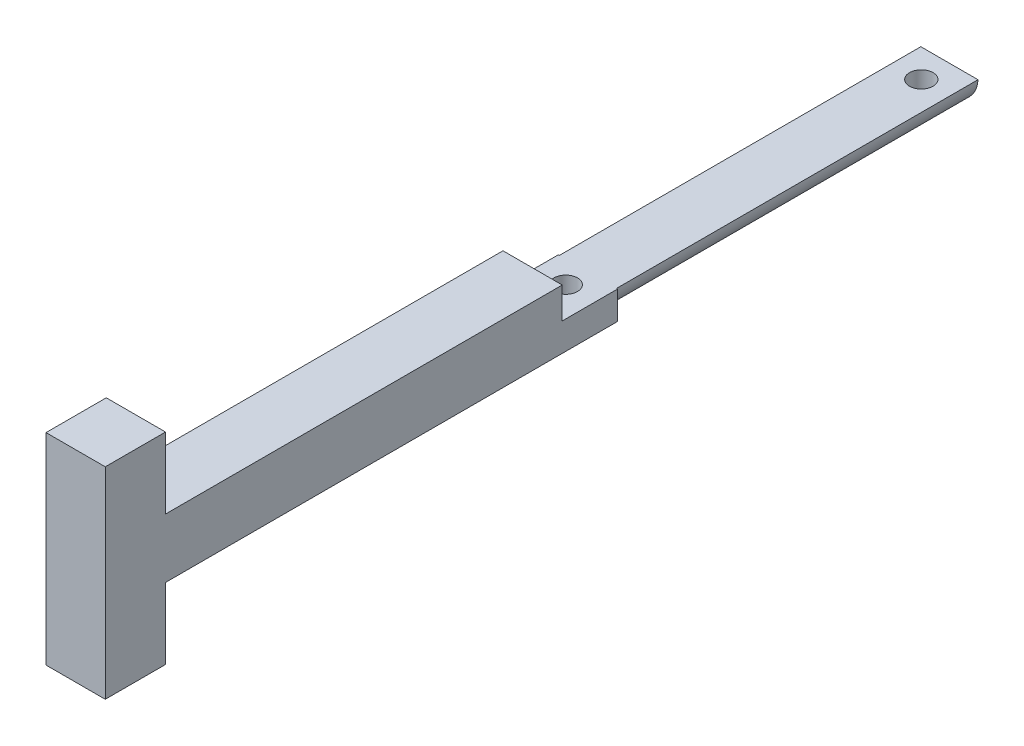
ISO-10303-21;
HEADER;
FILE_DESCRIPTION(('STEP AP214'),'2;1');
FILE_NAME('part.step','',(''),(''),'','','');
FILE_SCHEMA(('AUTOMOTIVE_DESIGN { 1 0 10303 214 1 1 1 1 }'));
ENDSEC;
DATA;
#1=APPLICATION_CONTEXT('core data for automotive mechanical design processes');
#2=APPLICATION_PROTOCOL_DEFINITION('international standard','automotive_design',2000,#1);
#3=PRODUCT_CONTEXT('',#1,'mechanical');
#4=PRODUCT('Part','Part','',(#3));
#5=PRODUCT_RELATED_PRODUCT_CATEGORY('part','',(#4));
#6=PRODUCT_DEFINITION_FORMATION('','',#4);
#7=PRODUCT_DEFINITION_CONTEXT('part definition',#1,'design');
#8=PRODUCT_DEFINITION('design','',#6,#7);
#9=PRODUCT_DEFINITION_SHAPE('','',#8);
#10=(LENGTH_UNIT() NAMED_UNIT(*) SI_UNIT(.MILLI.,.METRE.));
#11=(NAMED_UNIT(*) PLANE_ANGLE_UNIT() SI_UNIT($,.RADIAN.));
#12=(NAMED_UNIT(*) SI_UNIT($,.STERADIAN.) SOLID_ANGLE_UNIT());
#13=UNCERTAINTY_MEASURE_WITH_UNIT(LENGTH_MEASURE(1.E-05),#10,'distance_accuracy_value','');
#14=(GEOMETRIC_REPRESENTATION_CONTEXT(3) GLOBAL_UNCERTAINTY_ASSIGNED_CONTEXT((#13)) GLOBAL_UNIT_ASSIGNED_CONTEXT((#10,
#11,#12)) REPRESENTATION_CONTEXT('',''));
#15=CARTESIAN_POINT('',(0.,0.,0.));
#16=DIRECTION('',(0.,0.,1.));
#17=DIRECTION('',(1.,0.,0.));
#18=AXIS2_PLACEMENT_3D('',#15,#16,#17);
#19=CARTESIAN_POINT('',(0.,-7.05,-2.2));
#20=DIRECTION('',(0.,1.,0.));
#21=DIRECTION('',(-1.,0.,0.));
#22=AXIS2_PLACEMENT_3D('',#19,#20,#21);
#23=CYLINDRICAL_SURFACE('',#22,1.175);
#24=CARTESIAN_POINT('',(0.,-0.149999999999999,-2.2));
#25=DIRECTION('',(0.,-1.,0.));
#26=DIRECTION('',(0.,0.,-1.));
#27=AXIS2_PLACEMENT_3D('',#24,#25,#26);
#28=CIRCLE('',#27,1.175);
#29=CARTESIAN_POINT('',(0.,-0.149999999999999,-3.375));
#30=VERTEX_POINT('',#29);
#31=EDGE_CURVE('E169',#30,#30,#28,.F.);
#32=ORIENTED_EDGE('',*,*,#31,.T.);
#33=EDGE_LOOP('',(#32));
#34=FACE_BOUND('',#33,.T.);
#35=CARTESIAN_POINT('',(-1.175,-2.59651208354592,-2.2));
#36=CARTESIAN_POINT('',(-1.17499329710583,-2.59651851272934,-2.13726128833087));
#37=CARTESIAN_POINT('',(-1.16994332561099,-2.59881906653009,-2.07441742069479));
#38=CARTESIAN_POINT('',(-1.14993654664118,-2.60773039865933,-1.95053928076174));
#39=CARTESIAN_POINT('',(-1.1349525796863,-2.61435299264052,-1.88951045004657));
#40=CARTESIAN_POINT('',(-1.09575667793182,-2.63101984862373,-1.77127626311953));
#41=CARTESIAN_POINT('',(-1.07158182466941,-2.64105034404038,-1.71405661447788));
#42=CARTESIAN_POINT('',(-1.01479902027141,-2.66338317673593,-1.60450223218359));
#43=CARTESIAN_POINT('',(-0.982193187209018,-2.67568494319303,-1.55216627611269));
#44=CARTESIAN_POINT('',(-0.907350757531601,-2.70201232191426,-1.45064545106289));
#45=CARTESIAN_POINT('',(-0.864681812568224,-2.71609561143148,-1.40179411248883));
#46=CARTESIAN_POINT('',(-0.771832663840417,-2.74392456868612,-1.31169458610813));
#47=CARTESIAN_POINT('',(-0.721649612293354,-2.7576701061092,-1.27044929421138));
#48=CARTESIAN_POINT('',(-0.612589122427016,-2.78397332974996,-1.19504448954162));
#49=CARTESIAN_POINT('',(-0.553433661608107,-2.79645615292838,-1.16125860479524));
#50=CARTESIAN_POINT('',(-0.429671477718866,-2.81812346563897,-1.10426153124341));
#51=CARTESIAN_POINT('',(-0.365067141072957,-2.82730938993306,-1.0810457413039));
#52=CARTESIAN_POINT('',(-0.235741207776902,-2.84093910139708,-1.04705161624532));
#53=CARTESIAN_POINT('',(-0.171194144990525,-2.84560113843011,-1.03569857862762));
#54=CARTESIAN_POINT('',(-0.0409540525128829,-2.85044952385287,-1.02389693806895));
#55=CARTESIAN_POINT('',(0.0247385122554054,-2.85063764761258,-1.02344400966854));
#56=CARTESIAN_POINT('',(0.151232626674928,-2.84664665650361,-1.03315058406118));
#57=CARTESIAN_POINT('',(0.21209230755517,-2.8427271944627,-1.04267911305258));
#58=CARTESIAN_POINT('',(0.331259334937749,-2.83131624854964,-1.07099873274938));
#59=CARTESIAN_POINT('',(0.389566493156407,-2.82382450165542,-1.08979050549724));
#60=CARTESIAN_POINT('',(0.503038768563509,-2.8058519275574,-1.13632891912547));
#61=CARTESIAN_POINT('',(0.558142550326341,-2.79532733818341,-1.16420751160991));
#62=CARTESIAN_POINT('',(0.66303362578684,-2.77232286186529,-1.22800047996629));
#63=CARTESIAN_POINT('',(0.712819044994588,-2.75984228932136,-1.26391767537918));
#64=CARTESIAN_POINT('',(0.809320734037079,-2.73316251849976,-1.34566105589417));
#65=CARTESIAN_POINT('',(0.85558608732322,-2.71890415640297,-1.39200101150407));
#66=CARTESIAN_POINT('',(0.939881079327661,-2.6909292659936,-1.49182035298154));
#67=CARTESIAN_POINT('',(0.977907672082037,-2.67721293960492,-1.54530236757832));
#68=CARTESIAN_POINT('',(1.04576901012178,-2.65145802120997,-1.6600274644406));
#69=CARTESIAN_POINT('',(1.07530688457442,-2.63948615097963,-1.72146240658446));
#70=CARTESIAN_POINT('',(1.12343498471141,-2.61936678436805,-1.84905932213926));
#71=CARTESIAN_POINT('',(1.1420328469957,-2.61121662107875,-1.91521796194464));
#72=CARTESIAN_POINT('',(1.16661959391837,-2.60032101010456,-2.04587074915053));
#73=CARTESIAN_POINT('',(1.17333825868394,-2.59726347760415,-2.11020111439051));
#74=CARTESIAN_POINT('',(1.17611541110972,-2.59600788562174,-2.23912881853631));
#75=CARTESIAN_POINT('',(1.17217746019271,-2.59780820265414,-2.30372606104781));
#76=CARTESIAN_POINT('',(1.15441877379919,-2.60574358301127,-2.42712937419615));
#77=CARTESIAN_POINT('',(1.14122697599662,-2.61160250247034,-2.48604595661254));
#78=CARTESIAN_POINT('',(1.10616378705067,-2.6266447961046,-2.60078354119904));
#79=CARTESIAN_POINT('',(1.08429039520324,-2.63582893654588,-2.6566038264345));
#80=CARTESIAN_POINT('',(1.03146633511012,-2.65695620225538,-2.76617659319805));
#81=CARTESIAN_POINT('',(1.00017373172697,-2.6689988047802,-2.81974443658798));
#82=CARTESIAN_POINT('',(0.929742181906772,-2.69434199782386,-2.92112265933136));
#83=CARTESIAN_POINT('',(0.890599891127926,-2.70764312325344,-2.96893057073386));
#84=CARTESIAN_POINT('',(0.801916163022788,-2.73527901171184,-3.0613801506117));
#85=CARTESIAN_POINT('',(0.751795887637102,-2.74961201292547,-3.10546924500052));
#86=CARTESIAN_POINT('',(0.644533164561743,-2.77671273120582,-3.18470671980217));
#87=CARTESIAN_POINT('',(0.587390266287499,-2.78948034772944,-3.21985452608064));
#88=CARTESIAN_POINT('',(0.467357452781206,-2.81208258092243,-3.28014720091478));
#89=CARTESIAN_POINT('',(0.404457550289555,-2.82191196937146,-3.30527426500057));
#90=CARTESIAN_POINT('',(0.274815297935318,-2.83746859839297,-3.34441202534989));
#91=CARTESIAN_POINT('',(0.208075205910761,-2.84319822332421,-3.3584291834738));
#92=CARTESIAN_POINT('',(0.0775921257149425,-2.84964071454381,-3.37414786704286));
#93=CARTESIAN_POINT('',(0.0139580754073257,-2.85067108479243,-3.37662906113305));
#94=CARTESIAN_POINT('',(-0.112794467566046,-2.8484719532813,-3.37129158662869));
#95=CARTESIAN_POINT('',(-0.175913045492914,-2.84524317097358,-3.36347465758365));
#96=CARTESIAN_POINT('',(-0.297622259403981,-2.83505333694944,-3.33832219810234));
#97=CARTESIAN_POINT('',(-0.356293921001832,-2.82822363094716,-3.32132115758578));
#98=CARTESIAN_POINT('',(-0.46993337808027,-2.81157676017639,-3.27864439920616));
#99=CARTESIAN_POINT('',(-0.524900460063007,-2.80175902191327,-3.25296701598356));
#100=CARTESIAN_POINT('',(-0.632292036683678,-2.77954114016312,-3.1923723079047));
#101=CARTESIAN_POINT('',(-0.684490966558574,-2.76704470566457,-3.15709133044169));
#102=CARTESIAN_POINT('',(-0.782448421552795,-2.74095754879123,-3.07882501670758));
#103=CARTESIAN_POINT('',(-0.828204607595317,-2.72736643178614,-3.03583689512192));
#104=CARTESIAN_POINT('',(-0.915133244033183,-2.69949102821242,-2.940009003795));
#105=CARTESIAN_POINT('',(-0.955799920384749,-2.68522060417839,-2.88670474318381));
#106=CARTESIAN_POINT('',(-1.02767966458612,-2.65854293428749,-2.77357646909639));
#107=CARTESIAN_POINT('',(-1.05888751033524,-2.64613671953572,-2.71374887886453));
#108=CARTESIAN_POINT('',(-1.11059027104971,-2.6248561786182,-2.58950431401495));
#109=CARTESIAN_POINT('',(-1.131154467251,-2.6159591035555,-2.5251202016445));
#110=CARTESIAN_POINT('',(-1.16091669730976,-2.60289227340324,-2.39344507318811));
#111=CARTESIAN_POINT('',(-1.17015285752539,-2.59870666503546,-2.32616460121775));
#112=CARTESIAN_POINT('',(-1.17451365135615,-2.59673120959809,-2.23912268021968));
#113=CARTESIAN_POINT('',(-1.17500209044571,-2.59651007846296,-2.21956645406586));
#114=CARTESIAN_POINT('',(-1.175,-2.59651208354592,-2.2));
#115=B_SPLINE_CURVE_WITH_KNOTS('',3,(#35,#36,#37,#38,#39,#40,#41,#42,#43,#44,#45,#46,#47,#48,
#49,#50,#51,#52,#53,#54,#55,#56,#57,#58,#59,#60,#61,#62,#63,#64,#65,#66,#67,#68,#69,#70,#71,#72,
#73,#74,#75,#76,#77,#78,#79,#80,#81,#82,#83,#84,#85,#86,#87,#88,#89,#90,#91,#92,#93,#94,#95,#96,
#97,#98,#99,#100,#101,#102,#103,#104,#105,#106,#107,#108,#109,#110,#111,#112,#113,#114),
.UNSPECIFIED.,.T.,.F.,(4,2,2,2,2,2,2,2,2,2,2,2,2,2,2,2,2,2,2,2,2,2,2,2,2,2,2,2,2,2,2,2,2,2,2,2,
2,2,2,4),(0.,0.188161039054424,0.376838642381761,0.564762949766108,0.752640091651659,
0.950890590110442,1.14921641489652,1.35593329330019,1.5625601021654,1.7586330055383,
1.95462810057343,2.1389403699335,2.32326621203063,2.51039774840544,2.69759502434094,
2.8977487379925,3.09797632496058,3.30453179568287,3.51094291015932,3.70416424482463,
3.89732101322513,4.07848218017497,4.25968512061967,4.44848042429363,4.63735633532579,
4.84122506265824,5.04510687742401,5.24934934468285,5.45347293093555,5.64357830884874,
5.83365157845292,6.01722792018703,6.200839518071,6.39270971456264,6.58464939205362,
6.78932804409925,6.99411949166524,7.19756060180845,7.40031510184158,7.45899728114833),.UNSPECIFIED.);
#116=CARTESIAN_POINT('',(-1.175,-2.59651208354592,-2.2));
#117=VERTEX_POINT('',#116);
#118=EDGE_CURVE('E142',#117,#117,#115,.T.);
#119=ORIENTED_EDGE('',*,*,#118,.F.);
#120=EDGE_LOOP('',(#119));
#121=FACE_BOUND('',#120,.T.);
#122=ADVANCED_FACE('F34',(#34,#121),#23,.F.);
#123=CARTESIAN_POINT('',(-7.05,-0.149999999999999,-5.));
#124=DIRECTION('',(0.,-1.,0.));
#125=DIRECTION('',(0.,0.,-1.));
#126=AXIS2_PLACEMENT_3D('',#123,#124,#125);
#127=PLANE('',#126);
#128=CARTESIAN_POINT('',(0.,-0.150000000000003,33.2));
#129=DIRECTION('',(0.,-1.,0.));
#130=DIRECTION('',(0.,0.,-1.));
#131=AXIS2_PLACEMENT_3D('',#128,#129,#130);
#132=CIRCLE('',#131,1.175);
#133=CARTESIAN_POINT('',(0.,-0.150000000000003,32.025));
#134=VERTEX_POINT('',#133);
#135=EDGE_CURVE('E38',#134,#134,#132,.F.);
#136=ORIENTED_EDGE('',*,*,#135,.F.);
#137=EDGE_LOOP('',(#136));
#138=FACE_BOUND('',#137,.T.);
#139=ORIENTED_EDGE('',*,*,#31,.F.);
#140=EDGE_LOOP('',(#139));
#141=FACE_BOUND('',#140,.T.);
#142=DIRECTION('',(0.,0.,-1.));
#143=VECTOR('',#142,1.);
#144=CARTESIAN_POINT('',(2.84604989415154,-0.150000000000004,31.));
#145=LINE('',#144,#143);
#146=CARTESIAN_POINT('',(2.84604989415154,-0.149999999999999,-5.));
#147=VERTEX_POINT('',#146);
#148=CARTESIAN_POINT('',(2.84604989415154,-0.150000000000004,31.));
#149=VERTEX_POINT('',#148);
#150=EDGE_CURVE('E153',#147,#149,#145,.F.);
#151=ORIENTED_EDGE('',*,*,#150,.F.);
#152=DIRECTION('',(1.,0.,0.));
#153=VECTOR('',#152,1.);
#154=CARTESIAN_POINT('',(-7.05,-0.149999999999999,-5.));
#155=LINE('',#154,#153);
#156=CARTESIAN_POINT('',(-2.84604989415154,-0.150000000000001,-5.));
#157=VERTEX_POINT('',#156);
#158=EDGE_CURVE('E138',#157,#147,#155,.T.);
#159=ORIENTED_EDGE('',*,*,#158,.F.);
#160=DIRECTION('',(0.,0.,-1.));
#161=VECTOR('',#160,1.);
#162=CARTESIAN_POINT('',(-2.84604989415154,-0.150000000000003,31.));
#163=LINE('',#162,#161);
#164=CARTESIAN_POINT('',(-2.84604989415154,-0.150000000000003,31.));
#165=VERTEX_POINT('',#164);
#166=EDGE_CURVE('E145',#165,#157,#163,.T.);
#167=ORIENTED_EDGE('',*,*,#166,.F.);
#168=DIRECTION('',(1.,0.,0.));
#169=VECTOR('',#168,1.);
#170=CARTESIAN_POINT('',(0.,-0.150000000000004,31.));
#171=LINE('',#170,#169);
#172=CARTESIAN_POINT('',(-2.95,-0.150000000000004,31.));
#173=VERTEX_POINT('',#172);
#174=EDGE_CURVE('E150',#173,#165,#171,.T.);
#175=ORIENTED_EDGE('',*,*,#174,.F.);
#176=DIRECTION('',(0.,0.,-1.));
#177=VECTOR('',#176,1.);
#178=CARTESIAN_POINT('',(-2.95,-0.150000000000009,76.));
#179=LINE('',#178,#177);
#180=CARTESIAN_POINT('',(-2.95,-0.150000000000004,36.5));
#181=VERTEX_POINT('',#180);
#182=EDGE_CURVE('E157',#181,#173,#179,.T.);
#183=ORIENTED_EDGE('',*,*,#182,.F.);
#184=DIRECTION('',(1.,0.,0.));
#185=VECTOR('',#184,1.);
#186=CARTESIAN_POINT('',(-7.05,-0.150000000000004,36.5));
#187=LINE('',#186,#185);
#188=CARTESIAN_POINT('',(2.95,-0.150000000000004,36.5));
#189=VERTEX_POINT('',#188);
#190=EDGE_CURVE('E154',#181,#189,#187,.T.);
#191=ORIENTED_EDGE('',*,*,#190,.T.);
#192=DIRECTION('',(0.,0.,-1.));
#193=VECTOR('',#192,1.);
#194=CARTESIAN_POINT('',(2.95,-0.149999999999999,-5.));
#195=LINE('',#194,#193);
#196=CARTESIAN_POINT('',(2.95,-0.150000000000004,31.));
#197=VERTEX_POINT('',#196);
#198=EDGE_CURVE('E161',#189,#197,#195,.T.);
#199=ORIENTED_EDGE('',*,*,#198,.T.);
#200=EDGE_CURVE('E149',#149,#197,#171,.T.);
#201=ORIENTED_EDGE('',*,*,#200,.F.);
#202=EDGE_LOOP('',(#151,#159,#167,#175,#183,#191,#199,#201));
#203=FACE_BOUND('',#202,.T.);
#204=ADVANCED_FACE('F152',(#138,#141,#203),#127,.F.);
#205=CARTESIAN_POINT('',(0.,0.,31.));
#206=DIRECTION('',(0.,0.,-1.));
#207=DIRECTION('',(-1.,0.,0.));
#208=AXIS2_PLACEMENT_3D('',#205,#206,#207);
#209=CYLINDRICAL_SURFACE('',#208,2.85);
#210=CARTESIAN_POINT('',(0.,0.,31.));
#211=DIRECTION('',(0.,0.,1.));
#212=DIRECTION('',(1.,0.,0.));
#213=AXIS2_PLACEMENT_3D('',#210,#211,#212);
#214=CIRCLE('',#213,2.85);
#215=EDGE_CURVE('E12',#165,#149,#214,.T.);
#216=ORIENTED_EDGE('',*,*,#215,.F.);
#217=ORIENTED_EDGE('',*,*,#166,.T.);
#218=CARTESIAN_POINT('',(0.,0.,-5.));
#219=DIRECTION('',(0.,0.,1.));
#220=DIRECTION('',(1.,0.,0.));
#221=AXIS2_PLACEMENT_3D('',#218,#219,#220);
#222=CIRCLE('',#221,2.85);
#223=EDGE_CURVE('E134',#157,#147,#222,.T.);
#224=ORIENTED_EDGE('',*,*,#223,.T.);
#225=ORIENTED_EDGE('',*,*,#150,.T.);
#226=EDGE_LOOP('',(#216,#217,#224,#225));
#227=FACE_BOUND('',#226,.T.);
#228=ORIENTED_EDGE('',*,*,#118,.T.);
#229=EDGE_LOOP('',(#228));
#230=FACE_BOUND('',#229,.T.);
#231=ADVANCED_FACE('F36',(#227,#230),#209,.T.);
#232=CARTESIAN_POINT('',(0.,0.,31.));
#233=DIRECTION('',(0.,0.,1.));
#234=DIRECTION('',(1.,0.,0.));
#235=AXIS2_PLACEMENT_3D('',#232,#233,#234);
#236=PLANE('',#235);
#237=DIRECTION('',(0.,-1.,0.));
#238=VECTOR('',#237,1.);
#239=CARTESIAN_POINT('',(-2.95,-2.95,31.));
#240=LINE('',#239,#238);
#241=CARTESIAN_POINT('',(-2.95,-2.95,31.));
#242=VERTEX_POINT('',#241);
#243=EDGE_CURVE('E202',#173,#242,#240,.T.);
#244=ORIENTED_EDGE('',*,*,#243,.F.);
#245=ORIENTED_EDGE('',*,*,#174,.T.);
#246=ORIENTED_EDGE('',*,*,#215,.T.);
#247=ORIENTED_EDGE('',*,*,#200,.T.);
#248=DIRECTION('',(0.,1.,0.));
#249=VECTOR('',#248,1.);
#250=CARTESIAN_POINT('',(2.95,-2.95,31.));
#251=LINE('',#250,#249);
#252=CARTESIAN_POINT('',(2.95,-2.95,31.));
#253=VERTEX_POINT('',#252);
#254=EDGE_CURVE('E233',#253,#197,#251,.T.);
#255=ORIENTED_EDGE('',*,*,#254,.F.);
#256=DIRECTION('',(1.,0.,0.));
#257=VECTOR('',#256,1.);
#258=CARTESIAN_POINT('',(2.95,-2.95,31.));
#259=LINE('',#258,#257);
#260=EDGE_CURVE('E75',#242,#253,#259,.T.);
#261=ORIENTED_EDGE('',*,*,#260,.F.);
#262=EDGE_LOOP('',(#244,#245,#246,#247,#255,#261));
#263=FACE_BOUND('',#262,.T.);
#264=ADVANCED_FACE('F260',(#263),#236,.F.);
#265=CARTESIAN_POINT('',(-2.95,-2.95,76.));
#266=DIRECTION('',(1.,0.,0.));
#267=DIRECTION('',(0.,0.,-1.));
#268=AXIS2_PLACEMENT_3D('',#265,#266,#267);
#269=PLANE('',#268);
#270=DIRECTION('',(0.,-1.,0.));
#271=VECTOR('',#270,1.);
#272=CARTESIAN_POINT('',(-2.95,-2.95,36.5));
#273=LINE('',#272,#271);
#274=CARTESIAN_POINT('',(-2.95,2.95,36.5));
#275=VERTEX_POINT('',#274);
#276=EDGE_CURVE('E51',#275,#181,#273,.T.);
#277=ORIENTED_EDGE('',*,*,#276,.T.);
#278=ORIENTED_EDGE('',*,*,#182,.T.);
#279=ORIENTED_EDGE('',*,*,#243,.T.);
#280=DIRECTION('',(0.,0.,-1.));
#281=VECTOR('',#280,1.);
#282=CARTESIAN_POINT('',(-2.95,-2.95,76.));
#283=LINE('',#282,#281);
#284=CARTESIAN_POINT('',(-2.95,-2.95,76.));
#285=VERTEX_POINT('',#284);
#286=EDGE_CURVE('E43',#285,#242,#283,.T.);
#287=ORIENTED_EDGE('',*,*,#286,.F.);
#288=DIRECTION('',(0.,-1.,0.));
#289=VECTOR('',#288,1.);
#290=CARTESIAN_POINT('',(-2.95,-10.0245516400868,76.));
#291=LINE('',#290,#289);
#292=CARTESIAN_POINT('',(-2.95,-10.0245516400868,76.));
#293=VERTEX_POINT('',#292);
#294=EDGE_CURVE('E176',#285,#293,#291,.T.);
#295=ORIENTED_EDGE('',*,*,#294,.T.);
#296=DIRECTION('',(0.,0.,-1.));
#297=VECTOR('',#296,1.);
#298=CARTESIAN_POINT('',(-2.95,-10.0245516400868,82.));
#299=LINE('',#298,#297);
#300=CARTESIAN_POINT('',(-2.95,-10.0245516400868,82.));
#301=VERTEX_POINT('',#300);
#302=EDGE_CURVE('E199',#301,#293,#299,.T.);
#303=ORIENTED_EDGE('',*,*,#302,.F.);
#304=DIRECTION('',(0.,-1.,0.));
#305=VECTOR('',#304,1.);
#306=CARTESIAN_POINT('',(-2.95,-10.0245516400868,82.));
#307=LINE('',#306,#305);
#308=CARTESIAN_POINT('',(-2.95,10.0245516400868,82.));
#309=VERTEX_POINT('',#308);
#310=EDGE_CURVE('E177',#309,#301,#307,.T.);
#311=ORIENTED_EDGE('',*,*,#310,.F.);
#312=DIRECTION('',(0.,0.,-1.));
#313=VECTOR('',#312,1.);
#314=CARTESIAN_POINT('',(-2.95,10.0245516400868,82.));
#315=LINE('',#314,#313);
#316=CARTESIAN_POINT('',(-2.95,10.0245516400868,76.));
#317=VERTEX_POINT('',#316);
#318=EDGE_CURVE('E187',#309,#317,#315,.T.);
#319=ORIENTED_EDGE('',*,*,#318,.T.);
#320=CARTESIAN_POINT('',(-2.95,2.95,76.));
#321=VERTEX_POINT('',#320);
#322=EDGE_CURVE('E196',#317,#321,#291,.T.);
#323=ORIENTED_EDGE('',*,*,#322,.T.);
#324=DIRECTION('',(0.,0.,-1.));
#325=VECTOR('',#324,1.);
#326=CARTESIAN_POINT('',(-2.95,2.95,76.));
#327=LINE('',#326,#325);
#328=EDGE_CURVE('E236',#321,#275,#327,.T.);
#329=ORIENTED_EDGE('',*,*,#328,.T.);
#330=EDGE_LOOP('',(#277,#278,#279,#287,#295,#303,#311,#319,#323,#329));
#331=FACE_BOUND('',#330,.T.);
#332=ADVANCED_FACE('F257',(#331),#269,.F.);
#333=CARTESIAN_POINT('',(2.95,-2.95,76.));
#334=DIRECTION('',(0.,1.,0.));
#335=DIRECTION('',(0.,0.,1.));
#336=AXIS2_PLACEMENT_3D('',#333,#334,#335);
#337=PLANE('',#336);
#338=CARTESIAN_POINT('',(0.,-2.95,33.2));
#339=DIRECTION('',(0.,1.,0.));
#340=DIRECTION('',(0.,0.,1.));
#341=AXIS2_PLACEMENT_3D('',#338,#339,#340);
#342=CIRCLE('',#341,1.175);
#343=CARTESIAN_POINT('',(0.,-2.95,34.375));
#344=VERTEX_POINT('',#343);
#345=EDGE_CURVE('E173',#344,#344,#342,.T.);
#346=ORIENTED_EDGE('',*,*,#345,.T.);
#347=EDGE_LOOP('',(#346));
#348=FACE_BOUND('',#347,.T.);
#349=ORIENTED_EDGE('',*,*,#260,.T.);
#350=DIRECTION('',(0.,0.,-1.));
#351=VECTOR('',#350,1.);
#352=CARTESIAN_POINT('',(2.95,-2.95,76.));
#353=LINE('',#352,#351);
#354=CARTESIAN_POINT('',(2.95,-2.95,76.));
#355=VERTEX_POINT('',#354);
#356=EDGE_CURVE('E243',#355,#253,#353,.T.);
#357=ORIENTED_EDGE('',*,*,#356,.F.);
#358=DIRECTION('',(1.,0.,0.));
#359=VECTOR('',#358,1.);
#360=CARTESIAN_POINT('',(2.95,-2.95,76.));
#361=LINE('',#360,#359);
#362=EDGE_CURVE('E79',#285,#355,#361,.T.);
#363=ORIENTED_EDGE('',*,*,#362,.F.);
#364=ORIENTED_EDGE('',*,*,#286,.T.);
#365=EDGE_LOOP('',(#349,#357,#363,#364));
#366=FACE_BOUND('',#365,.T.);
#367=ADVANCED_FACE('F262',(#348,#366),#337,.F.);
#368=CARTESIAN_POINT('',(2.95,-2.95,76.));
#369=DIRECTION('',(-1.,0.,0.));
#370=DIRECTION('',(0.,0.,1.));
#371=AXIS2_PLACEMENT_3D('',#368,#369,#370);
#372=PLANE('',#371);
#373=ORIENTED_EDGE('',*,*,#254,.T.);
#374=ORIENTED_EDGE('',*,*,#198,.F.);
#375=DIRECTION('',(0.,-1.,0.));
#376=VECTOR('',#375,1.);
#377=CARTESIAN_POINT('',(2.95,2.95,36.5));
#378=LINE('',#377,#376);
#379=CARTESIAN_POINT('',(2.95,2.95,36.5));
#380=VERTEX_POINT('',#379);
#381=EDGE_CURVE('E290',#380,#189,#378,.T.);
#382=ORIENTED_EDGE('',*,*,#381,.F.);
#383=DIRECTION('',(0.,0.,-1.));
#384=VECTOR('',#383,1.);
#385=CARTESIAN_POINT('',(2.95,2.95,76.));
#386=LINE('',#385,#384);
#387=CARTESIAN_POINT('',(2.95,2.95,76.));
#388=VERTEX_POINT('',#387);
#389=EDGE_CURVE('E60',#388,#380,#386,.T.);
#390=ORIENTED_EDGE('',*,*,#389,.F.);
#391=DIRECTION('',(0.,1.,0.));
#392=VECTOR('',#391,1.);
#393=CARTESIAN_POINT('',(2.95,-10.0245516400868,76.));
#394=LINE('',#393,#392);
#395=CARTESIAN_POINT('',(2.95,10.0245516400868,76.));
#396=VERTEX_POINT('',#395);
#397=EDGE_CURVE('E215',#388,#396,#394,.T.);
#398=ORIENTED_EDGE('',*,*,#397,.T.);
#399=DIRECTION('',(0.,0.,-1.));
#400=VECTOR('',#399,1.);
#401=CARTESIAN_POINT('',(2.95,10.0245516400868,82.));
#402=LINE('',#401,#400);
#403=CARTESIAN_POINT('',(2.95,10.0245516400868,82.));
#404=VERTEX_POINT('',#403);
#405=EDGE_CURVE('E206',#404,#396,#402,.T.);
#406=ORIENTED_EDGE('',*,*,#405,.F.);
#407=DIRECTION('',(0.,1.,0.));
#408=VECTOR('',#407,1.);
#409=CARTESIAN_POINT('',(2.95,-10.0245516400868,82.));
#410=LINE('',#409,#408);
#411=CARTESIAN_POINT('',(2.95,-10.0245516400868,82.));
#412=VERTEX_POINT('',#411);
#413=EDGE_CURVE('E183',#412,#404,#410,.T.);
#414=ORIENTED_EDGE('',*,*,#413,.F.);
#415=DIRECTION('',(0.,0.,-1.));
#416=VECTOR('',#415,1.);
#417=CARTESIAN_POINT('',(2.95,-10.0245516400868,82.));
#418=LINE('',#417,#416);
#419=CARTESIAN_POINT('',(2.95,-10.0245516400868,76.));
#420=VERTEX_POINT('',#419);
#421=EDGE_CURVE('E203',#412,#420,#418,.T.);
#422=ORIENTED_EDGE('',*,*,#421,.T.);
#423=EDGE_CURVE('E211',#420,#355,#394,.T.);
#424=ORIENTED_EDGE('',*,*,#423,.T.);
#425=ORIENTED_EDGE('',*,*,#356,.T.);
#426=EDGE_LOOP('',(#373,#374,#382,#390,#398,#406,#414,#422,#424,#425));
#427=FACE_BOUND('',#426,.T.);
#428=ADVANCED_FACE('F230',(#427),#372,.F.);
#429=CARTESIAN_POINT('',(2.95,2.95,76.));
#430=DIRECTION('',(0.,-1.,0.));
#431=DIRECTION('',(0.,0.,-1.));
#432=AXIS2_PLACEMENT_3D('',#429,#430,#431);
#433=PLANE('',#432);
#434=ORIENTED_EDGE('',*,*,#389,.T.);
#435=DIRECTION('',(1.,0.,0.));
#436=VECTOR('',#435,1.);
#437=CARTESIAN_POINT('',(-7.05,2.95,36.5));
#438=LINE('',#437,#436);
#439=EDGE_CURVE('E158',#275,#380,#438,.T.);
#440=ORIENTED_EDGE('',*,*,#439,.F.);
#441=ORIENTED_EDGE('',*,*,#328,.F.);
#442=DIRECTION('',(-1.,0.,0.));
#443=VECTOR('',#442,1.);
#444=CARTESIAN_POINT('',(2.95,2.95,76.));
#445=LINE('',#444,#443);
#446=EDGE_CURVE('E232',#388,#321,#445,.T.);
#447=ORIENTED_EDGE('',*,*,#446,.F.);
#448=EDGE_LOOP('',(#434,#440,#441,#447));
#449=FACE_BOUND('',#448,.T.);
#450=ADVANCED_FACE('F273',(#449),#433,.F.);
#451=CARTESIAN_POINT('',(0.,0.,76.));
#452=DIRECTION('',(0.,0.,1.));
#453=DIRECTION('',(1.,0.,0.));
#454=AXIS2_PLACEMENT_3D('',#451,#452,#453);
#455=PLANE('',#454);
#456=ORIENTED_EDGE('',*,*,#294,.F.);
#457=ORIENTED_EDGE('',*,*,#362,.T.);
#458=ORIENTED_EDGE('',*,*,#423,.F.);
#459=DIRECTION('',(1.,0.,0.));
#460=VECTOR('',#459,1.);
#461=CARTESIAN_POINT('',(2.95,-10.0245516400868,76.));
#462=LINE('',#461,#460);
#463=EDGE_CURVE('E190',#293,#420,#462,.T.);
#464=ORIENTED_EDGE('',*,*,#463,.F.);
#465=EDGE_LOOP('',(#456,#457,#458,#464));
#466=FACE_BOUND('',#465,.T.);
#467=ADVANCED_FACE('F231',(#466),#455,.F.);
#468=ORIENTED_EDGE('',*,*,#397,.F.);
#469=ORIENTED_EDGE('',*,*,#446,.T.);
#470=ORIENTED_EDGE('',*,*,#322,.F.);
#471=DIRECTION('',(-1.,0.,0.));
#472=VECTOR('',#471,1.);
#473=CARTESIAN_POINT('',(2.95,10.0245516400868,76.));
#474=LINE('',#473,#472);
#475=EDGE_CURVE('E181',#396,#317,#474,.T.);
#476=ORIENTED_EDGE('',*,*,#475,.F.);
#477=EDGE_LOOP('',(#468,#469,#470,#476));
#478=FACE_BOUND('',#477,.T.);
#479=ADVANCED_FACE('F308',(#478),#455,.F.);
#480=CARTESIAN_POINT('',(2.95,-10.0245516400868,82.));
#481=DIRECTION('',(0.,1.,0.));
#482=DIRECTION('',(0.,0.,1.));
#483=AXIS2_PLACEMENT_3D('',#480,#481,#482);
#484=PLANE('',#483);
#485=ORIENTED_EDGE('',*,*,#463,.T.);
#486=ORIENTED_EDGE('',*,*,#421,.F.);
#487=DIRECTION('',(1.,0.,0.));
#488=VECTOR('',#487,1.);
#489=CARTESIAN_POINT('',(2.95,-10.0245516400868,82.));
#490=LINE('',#489,#488);
#491=EDGE_CURVE('E180',#301,#412,#490,.T.);
#492=ORIENTED_EDGE('',*,*,#491,.F.);
#493=ORIENTED_EDGE('',*,*,#302,.T.);
#494=EDGE_LOOP('',(#485,#486,#492,#493));
#495=FACE_BOUND('',#494,.T.);
#496=ADVANCED_FACE('F224',(#495),#484,.F.);
#497=CARTESIAN_POINT('',(2.95,10.0245516400868,82.));
#498=DIRECTION('',(0.,-1.,0.));
#499=DIRECTION('',(0.,0.,-1.));
#500=AXIS2_PLACEMENT_3D('',#497,#498,#499);
#501=PLANE('',#500);
#502=ORIENTED_EDGE('',*,*,#475,.T.);
#503=ORIENTED_EDGE('',*,*,#318,.F.);
#504=DIRECTION('',(-1.,0.,0.));
#505=VECTOR('',#504,1.);
#506=CARTESIAN_POINT('',(2.95,10.0245516400868,82.));
#507=LINE('',#506,#505);
#508=EDGE_CURVE('E185',#404,#309,#507,.T.);
#509=ORIENTED_EDGE('',*,*,#508,.F.);
#510=ORIENTED_EDGE('',*,*,#405,.T.);
#511=EDGE_LOOP('',(#502,#503,#509,#510));
#512=FACE_BOUND('',#511,.T.);
#513=ADVANCED_FACE('F304',(#512),#501,.F.);
#514=CARTESIAN_POINT('',(0.,0.,82.));
#515=DIRECTION('',(0.,0.,1.));
#516=DIRECTION('',(1.,0.,0.));
#517=AXIS2_PLACEMENT_3D('',#514,#515,#516);
#518=PLANE('',#517);
#519=ORIENTED_EDGE('',*,*,#310,.T.);
#520=ORIENTED_EDGE('',*,*,#491,.T.);
#521=ORIENTED_EDGE('',*,*,#413,.T.);
#522=ORIENTED_EDGE('',*,*,#508,.T.);
#523=EDGE_LOOP('',(#519,#520,#521,#522));
#524=FACE_BOUND('',#523,.T.);
#525=ADVANCED_FACE('F300',(#524),#518,.T.);
#526=CARTESIAN_POINT('',(0.,-7.05,33.2));
#527=DIRECTION('',(0.,1.,0.));
#528=DIRECTION('',(0.,0.,1.));
#529=AXIS2_PLACEMENT_3D('',#526,#527,#528);
#530=CYLINDRICAL_SURFACE('',#529,1.175);
#531=ORIENTED_EDGE('',*,*,#135,.T.);
#532=EDGE_LOOP('',(#531));
#533=FACE_BOUND('',#532,.T.);
#534=ORIENTED_EDGE('',*,*,#345,.F.);
#535=EDGE_LOOP('',(#534));
#536=FACE_BOUND('',#535,.T.);
#537=ADVANCED_FACE('F297',(#533,#536),#530,.F.);
#538=CARTESIAN_POINT('',(-7.05,2.95,36.5));
#539=DIRECTION('',(0.,0.,1.));
#540=DIRECTION('',(1.,0.,0.));
#541=AXIS2_PLACEMENT_3D('',#538,#539,#540);
#542=PLANE('',#541);
#543=ORIENTED_EDGE('',*,*,#439,.T.);
#544=ORIENTED_EDGE('',*,*,#381,.T.);
#545=ORIENTED_EDGE('',*,*,#190,.F.);
#546=ORIENTED_EDGE('',*,*,#276,.F.);
#547=EDGE_LOOP('',(#543,#544,#545,#546));
#548=FACE_BOUND('',#547,.T.);
#549=ADVANCED_FACE('F294',(#548),#542,.F.);
#550=CARTESIAN_POINT('',(0.,0.,-5.));
#551=DIRECTION('',(0.,0.,-1.));
#552=DIRECTION('',(-1.,0.,0.));
#553=AXIS2_PLACEMENT_3D('',#550,#551,#552);
#554=PLANE('',#553);
#555=ORIENTED_EDGE('',*,*,#158,.T.);
#556=ORIENTED_EDGE('',*,*,#223,.F.);
#557=EDGE_LOOP('',(#555,#556));
#558=FACE_BOUND('',#557,.T.);
#559=ADVANCED_FACE('F136',(#558),#554,.T.);
#560=CLOSED_SHELL('',(#122,#204,#231,#264,#332,#367,#428,#450,#467,#479,#496,#513,#525,#537,
#549,#559));
#561=MANIFOLD_SOLID_BREP('B2',#560);
#562=ADVANCED_BREP_SHAPE_REPRESENTATION('',(#18,#561),#14);
#563=SHAPE_DEFINITION_REPRESENTATION(#9,#562);
ENDSEC;
END-ISO-10303-21;
